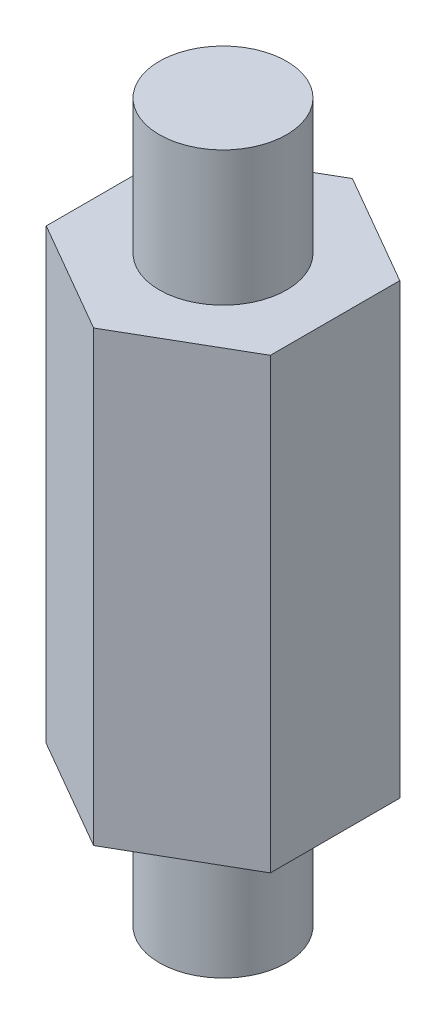
ISO-10303-21;
HEADER;
FILE_DESCRIPTION(('STEP AP214'),'2;1');
FILE_NAME('part.step','',(''),(''),'','','');
FILE_SCHEMA(('AUTOMOTIVE_DESIGN { 1 0 10303 214 1 1 1 1 }'));
ENDSEC;
DATA;
#1=APPLICATION_CONTEXT('core data for automotive mechanical design processes');
#2=APPLICATION_PROTOCOL_DEFINITION('international standard','automotive_design',2000,#1);
#3=PRODUCT_CONTEXT('',#1,'mechanical');
#4=PRODUCT('Part','Part','',(#3));
#5=PRODUCT_RELATED_PRODUCT_CATEGORY('part','',(#4));
#6=PRODUCT_DEFINITION_FORMATION('','',#4);
#7=PRODUCT_DEFINITION_CONTEXT('part definition',#1,'design');
#8=PRODUCT_DEFINITION('design','',#6,#7);
#9=PRODUCT_DEFINITION_SHAPE('','',#8);
#10=(LENGTH_UNIT() NAMED_UNIT(*) SI_UNIT(.MILLI.,.METRE.));
#11=(NAMED_UNIT(*) PLANE_ANGLE_UNIT() SI_UNIT($,.RADIAN.));
#12=(NAMED_UNIT(*) SI_UNIT($,.STERADIAN.) SOLID_ANGLE_UNIT());
#13=UNCERTAINTY_MEASURE_WITH_UNIT(LENGTH_MEASURE(1.E-05),#10,'distance_accuracy_value','');
#14=(GEOMETRIC_REPRESENTATION_CONTEXT(3) GLOBAL_UNCERTAINTY_ASSIGNED_CONTEXT((#13)) GLOBAL_UNIT_ASSIGNED_CONTEXT((#10,
#11,#12)) REPRESENTATION_CONTEXT('',''));
#15=CARTESIAN_POINT('',(0.,0.,0.));
#16=DIRECTION('',(0.,0.,1.));
#17=DIRECTION('',(1.,0.,0.));
#18=AXIS2_PLACEMENT_3D('',#15,#16,#17);
#19=CARTESIAN_POINT('',(2.5,10.,-1.44337567297406));
#20=DIRECTION('',(-0.5,0.,0.866025403784438));
#21=DIRECTION('',(0.866025403784439,0.,0.5));
#22=AXIS2_PLACEMENT_3D('',#19,#20,#21);
#23=PLANE('',#22);
#24=DIRECTION('',(-0.866025403784439,0.,-0.5));
#25=VECTOR('',#24,1.);
#26=CARTESIAN_POINT('',(2.5,0.,-1.44337567297406));
#27=LINE('',#26,#25);
#28=CARTESIAN_POINT('',(2.5,0.,-1.44337567297406));
#29=VERTEX_POINT('',#28);
#30=CARTESIAN_POINT('',(0.,0.,-2.88675134594813));
#31=VERTEX_POINT('',#30);
#32=EDGE_CURVE('E120',#29,#31,#27,.T.);
#33=ORIENTED_EDGE('',*,*,#32,.T.);
#34=DIRECTION('',(0.,-1.,0.));
#35=VECTOR('',#34,1.);
#36=CARTESIAN_POINT('',(0.,10.,-2.88675134594813));
#37=LINE('',#36,#35);
#38=CARTESIAN_POINT('',(0.,10.,-2.88675134594813));
#39=VERTEX_POINT('',#38);
#40=EDGE_CURVE('E43',#39,#31,#37,.T.);
#41=ORIENTED_EDGE('',*,*,#40,.F.);
#42=DIRECTION('',(-0.866025403784439,0.,-0.5));
#43=VECTOR('',#42,1.);
#44=CARTESIAN_POINT('',(2.5,10.,-1.44337567297406));
#45=LINE('',#44,#43);
#46=CARTESIAN_POINT('',(2.5,10.,-1.44337567297406));
#47=VERTEX_POINT('',#46);
#48=EDGE_CURVE('E131',#47,#39,#45,.T.);
#49=ORIENTED_EDGE('',*,*,#48,.F.);
#50=DIRECTION('',(0.,-1.,0.));
#51=VECTOR('',#50,1.);
#52=CARTESIAN_POINT('',(2.5,10.,-1.44337567297406));
#53=LINE('',#52,#51);
#54=EDGE_CURVE('E116',#47,#29,#53,.T.);
#55=ORIENTED_EDGE('',*,*,#54,.T.);
#56=EDGE_LOOP('',(#33,#41,#49,#55));
#57=FACE_BOUND('',#56,.T.);
#58=ADVANCED_FACE('F35',(#57),#23,.F.);
#59=CARTESIAN_POINT('',(0.,10.,-2.88675134594813));
#60=DIRECTION('',(0.5,0.,0.866025403784439));
#61=DIRECTION('',(0.866025403784439,0.,-0.5));
#62=AXIS2_PLACEMENT_3D('',#59,#60,#61);
#63=PLANE('',#62);
#64=DIRECTION('',(-0.866025403784439,0.,0.5));
#65=VECTOR('',#64,1.);
#66=CARTESIAN_POINT('',(0.,0.,-2.88675134594813));
#67=LINE('',#66,#65);
#68=CARTESIAN_POINT('',(-2.5,0.,-1.44337567297407));
#69=VERTEX_POINT('',#68);
#70=EDGE_CURVE('E123',#31,#69,#67,.T.);
#71=ORIENTED_EDGE('',*,*,#70,.T.);
#72=DIRECTION('',(0.,-1.,0.));
#73=VECTOR('',#72,1.);
#74=CARTESIAN_POINT('',(-2.5,10.,-1.44337567297407));
#75=LINE('',#74,#73);
#76=CARTESIAN_POINT('',(-2.5,10.,-1.44337567297407));
#77=VERTEX_POINT('',#76);
#78=EDGE_CURVE('E135',#77,#69,#75,.T.);
#79=ORIENTED_EDGE('',*,*,#78,.F.);
#80=DIRECTION('',(-0.866025403784439,0.,0.5));
#81=VECTOR('',#80,1.);
#82=CARTESIAN_POINT('',(0.,10.,-2.88675134594813));
#83=LINE('',#82,#81);
#84=EDGE_CURVE('E89',#39,#77,#83,.T.);
#85=ORIENTED_EDGE('',*,*,#84,.F.);
#86=ORIENTED_EDGE('',*,*,#40,.T.);
#87=EDGE_LOOP('',(#71,#79,#85,#86));
#88=FACE_BOUND('',#87,.T.);
#89=ADVANCED_FACE('F138',(#88),#63,.F.);
#90=CARTESIAN_POINT('',(-2.5,10.,-1.44337567297407));
#91=DIRECTION('',(1.,0.,0.));
#92=DIRECTION('',(0.,0.,-1.));
#93=AXIS2_PLACEMENT_3D('',#90,#91,#92);
#94=PLANE('',#93);
#95=DIRECTION('',(0.,0.,1.));
#96=VECTOR('',#95,1.);
#97=CARTESIAN_POINT('',(-2.5,0.,-1.44337567297407));
#98=LINE('',#97,#96);
#99=CARTESIAN_POINT('',(-2.5,0.,1.44337567297406));
#100=VERTEX_POINT('',#99);
#101=EDGE_CURVE('E126',#69,#100,#98,.T.);
#102=ORIENTED_EDGE('',*,*,#101,.T.);
#103=DIRECTION('',(0.,-1.,0.));
#104=VECTOR('',#103,1.);
#105=CARTESIAN_POINT('',(-2.5,10.,1.44337567297406));
#106=LINE('',#105,#104);
#107=CARTESIAN_POINT('',(-2.5,10.,1.44337567297406));
#108=VERTEX_POINT('',#107);
#109=EDGE_CURVE('E111',#108,#100,#106,.T.);
#110=ORIENTED_EDGE('',*,*,#109,.F.);
#111=DIRECTION('',(0.,0.,1.));
#112=VECTOR('',#111,1.);
#113=CARTESIAN_POINT('',(-2.5,10.,-1.44337567297407));
#114=LINE('',#113,#112);
#115=EDGE_CURVE('E102',#77,#108,#114,.T.);
#116=ORIENTED_EDGE('',*,*,#115,.F.);
#117=ORIENTED_EDGE('',*,*,#78,.T.);
#118=EDGE_LOOP('',(#102,#110,#116,#117));
#119=FACE_BOUND('',#118,.T.);
#120=ADVANCED_FACE('F146',(#119),#94,.F.);
#121=CARTESIAN_POINT('',(-2.5,10.,1.44337567297406));
#122=DIRECTION('',(0.5,0.,-0.866025403784439));
#123=DIRECTION('',(-0.866025403784439,0.,-0.5));
#124=AXIS2_PLACEMENT_3D('',#121,#122,#123);
#125=PLANE('',#124);
#126=DIRECTION('',(0.866025403784439,0.,0.5));
#127=VECTOR('',#126,1.);
#128=CARTESIAN_POINT('',(-2.5,0.,1.44337567297406));
#129=LINE('',#128,#127);
#130=CARTESIAN_POINT('',(0.,0.,2.88675134594813));
#131=VERTEX_POINT('',#130);
#132=EDGE_CURVE('E110',#100,#131,#129,.T.);
#133=ORIENTED_EDGE('',*,*,#132,.T.);
#134=DIRECTION('',(0.,-1.,0.));
#135=VECTOR('',#134,1.);
#136=CARTESIAN_POINT('',(0.,10.,2.88675134594813));
#137=LINE('',#136,#135);
#138=CARTESIAN_POINT('',(0.,10.,2.88675134594813));
#139=VERTEX_POINT('',#138);
#140=EDGE_CURVE('E107',#139,#131,#137,.T.);
#141=ORIENTED_EDGE('',*,*,#140,.F.);
#142=DIRECTION('',(0.866025403784439,0.,0.5));
#143=VECTOR('',#142,1.);
#144=CARTESIAN_POINT('',(-2.5,10.,1.44337567297406));
#145=LINE('',#144,#143);
#146=EDGE_CURVE('E96',#108,#139,#145,.T.);
#147=ORIENTED_EDGE('',*,*,#146,.F.);
#148=ORIENTED_EDGE('',*,*,#109,.T.);
#149=EDGE_LOOP('',(#133,#141,#147,#148));
#150=FACE_BOUND('',#149,.T.);
#151=ADVANCED_FACE('F108',(#150),#125,.F.);
#152=CARTESIAN_POINT('',(0.,10.,2.88675134594813));
#153=DIRECTION('',(-0.5,0.,-0.866025403784439));
#154=DIRECTION('',(-0.866025403784439,0.,0.5));
#155=AXIS2_PLACEMENT_3D('',#152,#153,#154);
#156=PLANE('',#155);
#157=DIRECTION('',(0.866025403784439,0.,-0.5));
#158=VECTOR('',#157,1.);
#159=CARTESIAN_POINT('',(0.,0.,2.88675134594813));
#160=LINE('',#159,#158);
#161=CARTESIAN_POINT('',(2.5,0.,1.44337567297407));
#162=VERTEX_POINT('',#161);
#163=EDGE_CURVE('E74',#131,#162,#160,.T.);
#164=ORIENTED_EDGE('',*,*,#163,.T.);
#165=DIRECTION('',(0.,-1.,0.));
#166=VECTOR('',#165,1.);
#167=CARTESIAN_POINT('',(2.5,10.,1.44337567297407));
#168=LINE('',#167,#166);
#169=CARTESIAN_POINT('',(2.5,10.,1.44337567297407));
#170=VERTEX_POINT('',#169);
#171=EDGE_CURVE('E112',#170,#162,#168,.T.);
#172=ORIENTED_EDGE('',*,*,#171,.F.);
#173=DIRECTION('',(0.866025403784439,0.,-0.5));
#174=VECTOR('',#173,1.);
#175=CARTESIAN_POINT('',(0.,10.,2.88675134594813));
#176=LINE('',#175,#174);
#177=EDGE_CURVE('E100',#139,#170,#176,.T.);
#178=ORIENTED_EDGE('',*,*,#177,.F.);
#179=ORIENTED_EDGE('',*,*,#140,.T.);
#180=EDGE_LOOP('',(#164,#172,#178,#179));
#181=FACE_BOUND('',#180,.T.);
#182=ADVANCED_FACE('F114',(#181),#156,.F.);
#183=CARTESIAN_POINT('',(2.5,10.,1.44337567297407));
#184=DIRECTION('',(-1.,0.,0.));
#185=DIRECTION('',(0.,0.,1.));
#186=AXIS2_PLACEMENT_3D('',#183,#184,#185);
#187=PLANE('',#186);
#188=DIRECTION('',(0.,0.,-1.));
#189=VECTOR('',#188,1.);
#190=CARTESIAN_POINT('',(2.5,0.,1.44337567297407));
#191=LINE('',#190,#189);
#192=EDGE_CURVE('E80',#162,#29,#191,.T.);
#193=ORIENTED_EDGE('',*,*,#192,.T.);
#194=ORIENTED_EDGE('',*,*,#54,.F.);
#195=DIRECTION('',(0.,0.,-1.));
#196=VECTOR('',#195,1.);
#197=CARTESIAN_POINT('',(2.5,10.,1.44337567297407));
#198=LINE('',#197,#196);
#199=EDGE_CURVE('E51',#170,#47,#198,.T.);
#200=ORIENTED_EDGE('',*,*,#199,.F.);
#201=ORIENTED_EDGE('',*,*,#171,.T.);
#202=EDGE_LOOP('',(#193,#194,#200,#201));
#203=FACE_BOUND('',#202,.T.);
#204=ADVANCED_FACE('F177',(#203),#187,.F.);
#205=CARTESIAN_POINT('',(0.,10.,0.));
#206=DIRECTION('',(0.,1.,0.));
#207=DIRECTION('',(0.,0.,1.));
#208=AXIS2_PLACEMENT_3D('',#205,#206,#207);
#209=PLANE('',#208);
#210=CARTESIAN_POINT('',(0.,10.,0.));
#211=DIRECTION('',(0.,1.,0.));
#212=DIRECTION('',(0.,0.,1.));
#213=AXIS2_PLACEMENT_3D('',#210,#211,#212);
#214=CIRCLE('',#213,1.42);
#215=CARTESIAN_POINT('',(0.,10.,1.42));
#216=VERTEX_POINT('',#215);
#217=EDGE_CURVE('E150',#216,#216,#214,.T.);
#218=ORIENTED_EDGE('',*,*,#217,.F.);
#219=EDGE_LOOP('',(#218));
#220=FACE_BOUND('',#219,.T.);
#221=ORIENTED_EDGE('',*,*,#48,.T.);
#222=ORIENTED_EDGE('',*,*,#84,.T.);
#223=ORIENTED_EDGE('',*,*,#115,.T.);
#224=ORIENTED_EDGE('',*,*,#146,.T.);
#225=ORIENTED_EDGE('',*,*,#177,.T.);
#226=ORIENTED_EDGE('',*,*,#199,.T.);
#227=EDGE_LOOP('',(#221,#222,#223,#224,#225,#226));
#228=FACE_BOUND('',#227,.T.);
#229=ADVANCED_FACE('F98',(#220,#228),#209,.T.);
#230=CARTESIAN_POINT('',(0.,0.,0.));
#231=DIRECTION('',(0.,1.,0.));
#232=DIRECTION('',(0.,0.,1.));
#233=AXIS2_PLACEMENT_3D('',#230,#231,#232);
#234=PLANE('',#233);
#235=CARTESIAN_POINT('',(0.,0.,0.));
#236=DIRECTION('',(0.,1.,0.));
#237=DIRECTION('',(0.,0.,1.));
#238=AXIS2_PLACEMENT_3D('',#235,#236,#237);
#239=CIRCLE('',#238,1.42);
#240=CARTESIAN_POINT('',(0.,0.,1.42));
#241=VERTEX_POINT('',#240);
#242=EDGE_CURVE('E11',#241,#241,#239,.F.);
#243=ORIENTED_EDGE('',*,*,#242,.F.);
#244=EDGE_LOOP('',(#243));
#245=FACE_BOUND('',#244,.T.);
#246=ORIENTED_EDGE('',*,*,#32,.F.);
#247=ORIENTED_EDGE('',*,*,#192,.F.);
#248=ORIENTED_EDGE('',*,*,#163,.F.);
#249=ORIENTED_EDGE('',*,*,#132,.F.);
#250=ORIENTED_EDGE('',*,*,#101,.F.);
#251=ORIENTED_EDGE('',*,*,#70,.F.);
#252=EDGE_LOOP('',(#246,#247,#248,#249,#250,#251));
#253=FACE_BOUND('',#252,.T.);
#254=ADVANCED_FACE('F143',(#245,#253),#234,.F.);
#255=CARTESIAN_POINT('',(0.,13.,0.));
#256=DIRECTION('',(0.,-1.,0.));
#257=DIRECTION('',(0.,0.,-1.));
#258=AXIS2_PLACEMENT_3D('',#255,#256,#257);
#259=CYLINDRICAL_SURFACE('',#258,1.42);
#260=CARTESIAN_POINT('',(0.,13.,0.));
#261=DIRECTION('',(0.,1.,0.));
#262=DIRECTION('',(0.,0.,1.));
#263=AXIS2_PLACEMENT_3D('',#260,#261,#262);
#264=CIRCLE('',#263,1.42);
#265=CARTESIAN_POINT('',(0.,13.,1.42));
#266=VERTEX_POINT('',#265);
#267=EDGE_CURVE('E124',#266,#266,#264,.T.);
#268=ORIENTED_EDGE('',*,*,#267,.F.);
#269=EDGE_LOOP('',(#268));
#270=FACE_BOUND('',#269,.T.);
#271=ORIENTED_EDGE('',*,*,#217,.T.);
#272=EDGE_LOOP('',(#271));
#273=FACE_BOUND('',#272,.T.);
#274=ADVANCED_FACE('F169',(#270,#273),#259,.T.);
#275=CARTESIAN_POINT('',(0.,13.,0.));
#276=DIRECTION('',(0.,1.,0.));
#277=DIRECTION('',(0.,0.,1.));
#278=AXIS2_PLACEMENT_3D('',#275,#276,#277);
#279=PLANE('',#278);
#280=ORIENTED_EDGE('',*,*,#267,.T.);
#281=EDGE_LOOP('',(#280));
#282=FACE_BOUND('',#281,.T.);
#283=ADVANCED_FACE('F164',(#282),#279,.T.);
#284=CARTESIAN_POINT('',(0.,-3.,0.));
#285=DIRECTION('',(0.,1.,0.));
#286=DIRECTION('',(0.,0.,1.));
#287=AXIS2_PLACEMENT_3D('',#284,#285,#286);
#288=CYLINDRICAL_SURFACE('',#287,1.42);
#289=CARTESIAN_POINT('',(0.,-3.,0.));
#290=DIRECTION('',(0.,-1.,0.));
#291=DIRECTION('',(0.,0.,-1.));
#292=AXIS2_PLACEMENT_3D('',#289,#290,#291);
#293=CIRCLE('',#292,1.42);
#294=CARTESIAN_POINT('',(0.,-3.,-1.42));
#295=VERTEX_POINT('',#294);
#296=EDGE_CURVE('E153',#295,#295,#293,.T.);
#297=ORIENTED_EDGE('',*,*,#296,.F.);
#298=EDGE_LOOP('',(#297));
#299=FACE_BOUND('',#298,.T.);
#300=ORIENTED_EDGE('',*,*,#242,.T.);
#301=EDGE_LOOP('',(#300));
#302=FACE_BOUND('',#301,.T.);
#303=ADVANCED_FACE('F161',(#299,#302),#288,.T.);
#304=CARTESIAN_POINT('',(0.,-3.,0.));
#305=DIRECTION('',(0.,-1.,0.));
#306=DIRECTION('',(0.,0.,-1.));
#307=AXIS2_PLACEMENT_3D('',#304,#305,#306);
#308=PLANE('',#307);
#309=ORIENTED_EDGE('',*,*,#296,.T.);
#310=EDGE_LOOP('',(#309));
#311=FACE_BOUND('',#310,.T.);
#312=ADVANCED_FACE('F159',(#311),#308,.T.);
#313=CLOSED_SHELL('',(#58,#89,#120,#151,#182,#204,#229,#254,#274,#283,#303,#312));
#314=MANIFOLD_SOLID_BREP('B2',#313);
#315=ADVANCED_BREP_SHAPE_REPRESENTATION('',(#18,#314),#14);
#316=SHAPE_DEFINITION_REPRESENTATION(#9,#315);
ENDSEC;
END-ISO-10303-21;
